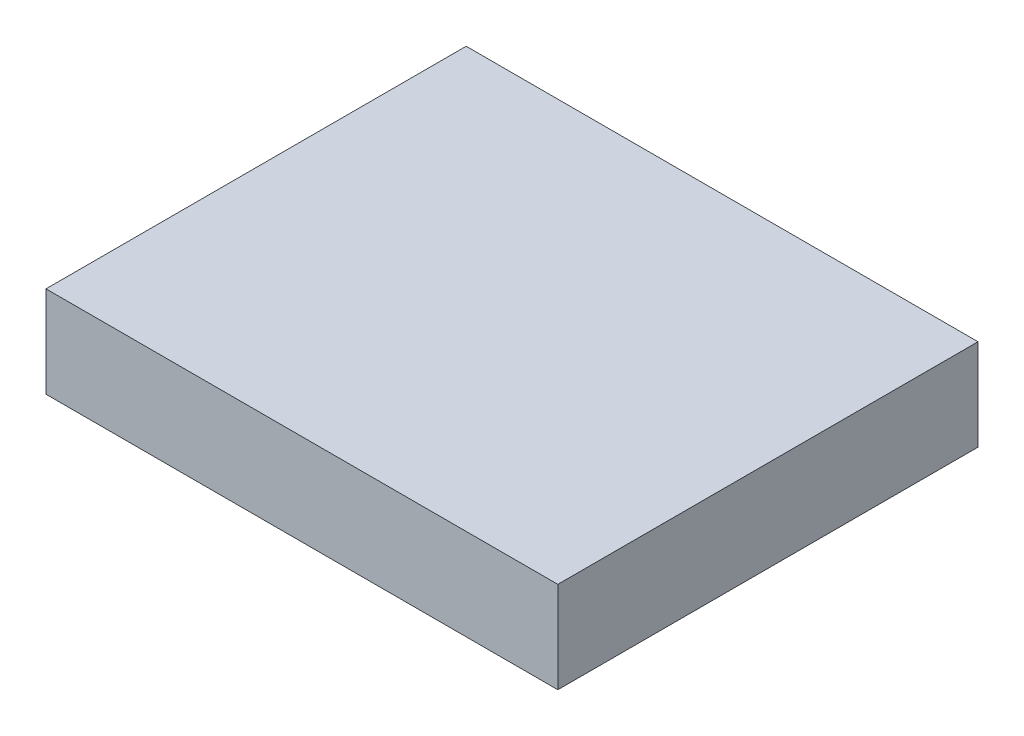
ISO-10303-21;
HEADER;
FILE_DESCRIPTION(('STEP AP214'),'2;1');
FILE_NAME('part.step','',(''),(''),'','','');
FILE_SCHEMA(('AUTOMOTIVE_DESIGN { 1 0 10303 214 1 1 1 1 }'));
ENDSEC;
DATA;
#1=APPLICATION_CONTEXT('core data for automotive mechanical design processes');
#2=APPLICATION_PROTOCOL_DEFINITION('international standard','automotive_design',2000,#1);
#3=PRODUCT_CONTEXT('',#1,'mechanical');
#4=PRODUCT('Part','Part','',(#3));
#5=PRODUCT_RELATED_PRODUCT_CATEGORY('part','',(#4));
#6=PRODUCT_DEFINITION_FORMATION('','',#4);
#7=PRODUCT_DEFINITION_CONTEXT('part definition',#1,'design');
#8=PRODUCT_DEFINITION('design','',#6,#7);
#9=PRODUCT_DEFINITION_SHAPE('','',#8);
#10=(LENGTH_UNIT() NAMED_UNIT(*) SI_UNIT(.MILLI.,.METRE.));
#11=(NAMED_UNIT(*) PLANE_ANGLE_UNIT() SI_UNIT($,.RADIAN.));
#12=(NAMED_UNIT(*) SI_UNIT($,.STERADIAN.) SOLID_ANGLE_UNIT());
#13=UNCERTAINTY_MEASURE_WITH_UNIT(LENGTH_MEASURE(1.E-05),#10,'distance_accuracy_value','');
#14=(GEOMETRIC_REPRESENTATION_CONTEXT(3) GLOBAL_UNCERTAINTY_ASSIGNED_CONTEXT((#13)) GLOBAL_UNIT_ASSIGNED_CONTEXT((#10,
#11,#12)) REPRESENTATION_CONTEXT('',''));
#15=CARTESIAN_POINT('',(0.,0.,0.));
#16=DIRECTION('',(0.,0.,1.));
#17=DIRECTION('',(1.,0.,0.));
#18=AXIS2_PLACEMENT_3D('',#15,#16,#17);
#19=CARTESIAN_POINT('',(-25.810949176075,5.900026226117,0.));
#20=DIRECTION('',(1.,0.,0.));
#21=DIRECTION('',(0.,1.,0.));
#22=AXIS2_PLACEMENT_3D('',#19,#20,#21);
#23=PLANE('',#22);
#24=DIRECTION('',(0.,-1.,0.));
#25=VECTOR('',#24,1.);
#26=CARTESIAN_POINT('',(-25.810949176075,5.921755362914,0.));
#27=LINE('',#26,#25);
#28=CARTESIAN_POINT('',(-25.810949176075,5.921755362914,0.));
#29=VERTEX_POINT('',#28);
#30=CARTESIAN_POINT('',(-25.810949176075,5.900026226117,0.));
#31=VERTEX_POINT('',#30);
#32=EDGE_CURVE('E11',#29,#31,#27,.T.);
#33=ORIENTED_EDGE('',*,*,#32,.F.);
#34=DIRECTION('',(0.,0.,1.));
#35=VECTOR('',#34,1.);
#36=CARTESIAN_POINT('',(-25.810949176075,5.921755362914,0.));
#37=LINE('',#36,#35);
#38=CARTESIAN_POINT('',(-25.810949176075,5.921755362914,0.1));
#39=VERTEX_POINT('',#38);
#40=EDGE_CURVE('E24',#29,#39,#37,.T.);
#41=ORIENTED_EDGE('',*,*,#40,.T.);
#42=DIRECTION('',(0.,1.,0.));
#43=VECTOR('',#42,1.);
#44=CARTESIAN_POINT('',(-25.810949176075,5.921755362914,0.1));
#45=LINE('',#44,#43);
#46=CARTESIAN_POINT('',(-25.810949176075,5.900026226117,0.1));
#47=VERTEX_POINT('',#46);
#48=EDGE_CURVE('E75',#47,#39,#45,.T.);
#49=ORIENTED_EDGE('',*,*,#48,.F.);
#50=DIRECTION('',(0.,0.,1.));
#51=VECTOR('',#50,1.);
#52=CARTESIAN_POINT('',(-25.810949176075,5.900026226117,0.));
#53=LINE('',#52,#51);
#54=EDGE_CURVE('E85',#31,#47,#53,.T.);
#55=ORIENTED_EDGE('',*,*,#54,.F.);
#56=EDGE_LOOP('',(#33,#41,#49,#55));
#57=FACE_BOUND('',#56,.T.);
#58=ADVANCED_FACE('F17',(#57),#23,.T.);
#59=CARTESIAN_POINT('',(-25.932755343422,5.900026226117,0.));
#60=DIRECTION('',(0.,-1.,0.));
#61=DIRECTION('',(1.,0.,0.));
#62=AXIS2_PLACEMENT_3D('',#59,#60,#61);
#63=PLANE('',#62);
#64=DIRECTION('',(-1.,0.,0.));
#65=VECTOR('',#64,1.);
#66=CARTESIAN_POINT('',(-25.810949176075,5.900026226117,0.));
#67=LINE('',#66,#65);
#68=CARTESIAN_POINT('',(-25.932755343422,5.900026226117,0.));
#69=VERTEX_POINT('',#68);
#70=EDGE_CURVE('E83',#31,#69,#67,.T.);
#71=ORIENTED_EDGE('',*,*,#70,.F.);
#72=ORIENTED_EDGE('',*,*,#54,.T.);
#73=DIRECTION('',(1.,0.,0.));
#74=VECTOR('',#73,1.);
#75=CARTESIAN_POINT('',(-25.810949176075,5.900026226117,0.1));
#76=LINE('',#75,#74);
#77=CARTESIAN_POINT('',(-25.932755343422,5.900026226117,0.1));
#78=VERTEX_POINT('',#77);
#79=EDGE_CURVE('E81',#78,#47,#76,.T.);
#80=ORIENTED_EDGE('',*,*,#79,.F.);
#81=DIRECTION('',(0.,0.,1.));
#82=VECTOR('',#81,1.);
#83=CARTESIAN_POINT('',(-25.932755343422,5.900026226117,0.));
#84=LINE('',#83,#82);
#85=EDGE_CURVE('E61',#69,#78,#84,.T.);
#86=ORIENTED_EDGE('',*,*,#85,.F.);
#87=EDGE_LOOP('',(#71,#72,#80,#86));
#88=FACE_BOUND('',#87,.T.);
#89=ADVANCED_FACE('F91',(#88),#63,.T.);
#90=CARTESIAN_POINT('',(-25.932755343422,5.921755362914,0.));
#91=DIRECTION('',(-1.,0.,0.));
#92=DIRECTION('',(0.,-1.,0.));
#93=AXIS2_PLACEMENT_3D('',#90,#91,#92);
#94=PLANE('',#93);
#95=DIRECTION('',(0.,1.,0.));
#96=VECTOR('',#95,1.);
#97=CARTESIAN_POINT('',(-25.932755343422,5.900026226117,0.));
#98=LINE('',#97,#96);
#99=CARTESIAN_POINT('',(-25.932755343422,5.921755362914,0.));
#100=VERTEX_POINT('',#99);
#101=EDGE_CURVE('E65',#69,#100,#98,.T.);
#102=ORIENTED_EDGE('',*,*,#101,.F.);
#103=ORIENTED_EDGE('',*,*,#85,.T.);
#104=DIRECTION('',(0.,-1.,0.));
#105=VECTOR('',#104,1.);
#106=CARTESIAN_POINT('',(-25.932755343422,5.900026226117,0.1));
#107=LINE('',#106,#105);
#108=CARTESIAN_POINT('',(-25.932755343422,5.921755362914,0.1));
#109=VERTEX_POINT('',#108);
#110=EDGE_CURVE('E54',#109,#78,#107,.T.);
#111=ORIENTED_EDGE('',*,*,#110,.F.);
#112=DIRECTION('',(0.,0.,1.));
#113=VECTOR('',#112,1.);
#114=CARTESIAN_POINT('',(-25.932755343422,5.921755362914,0.));
#115=LINE('',#114,#113);
#116=EDGE_CURVE('E58',#100,#109,#115,.T.);
#117=ORIENTED_EDGE('',*,*,#116,.F.);
#118=EDGE_LOOP('',(#102,#103,#111,#117));
#119=FACE_BOUND('',#118,.T.);
#120=ADVANCED_FACE('F57',(#119),#94,.T.);
#121=CARTESIAN_POINT('',(-25.810949176075,5.921755362914,0.));
#122=DIRECTION('',(0.,1.,0.));
#123=DIRECTION('',(-1.,0.,0.));
#124=AXIS2_PLACEMENT_3D('',#121,#122,#123);
#125=PLANE('',#124);
#126=DIRECTION('',(1.,0.,0.));
#127=VECTOR('',#126,1.);
#128=CARTESIAN_POINT('',(-25.932755343422,5.921755362914,0.));
#129=LINE('',#128,#127);
#130=EDGE_CURVE('E71',#100,#29,#129,.T.);
#131=ORIENTED_EDGE('',*,*,#130,.F.);
#132=ORIENTED_EDGE('',*,*,#116,.T.);
#133=DIRECTION('',(-1.,0.,0.));
#134=VECTOR('',#133,1.);
#135=CARTESIAN_POINT('',(-25.932755343422,5.921755362914,0.1));
#136=LINE('',#135,#134);
#137=EDGE_CURVE('E70',#39,#109,#136,.T.);
#138=ORIENTED_EDGE('',*,*,#137,.F.);
#139=ORIENTED_EDGE('',*,*,#40,.F.);
#140=EDGE_LOOP('',(#131,#132,#138,#139));
#141=FACE_BOUND('',#140,.T.);
#142=ADVANCED_FACE('F69',(#141),#125,.T.);
#143=CARTESIAN_POINT('',(-25.871852259748,5.910890794515,0.));
#144=DIRECTION('',(0.,0.,1.));
#145=DIRECTION('',(1.,0.,0.));
#146=AXIS2_PLACEMENT_3D('',#143,#144,#145);
#147=PLANE('',#146);
#148=ORIENTED_EDGE('',*,*,#130,.T.);
#149=ORIENTED_EDGE('',*,*,#32,.T.);
#150=ORIENTED_EDGE('',*,*,#70,.T.);
#151=ORIENTED_EDGE('',*,*,#101,.T.);
#152=EDGE_LOOP('',(#148,#149,#150,#151));
#153=FACE_BOUND('',#152,.T.);
#154=ADVANCED_FACE('F88',(#153),#147,.F.);
#155=CARTESIAN_POINT('',(-25.871852259748,5.910890794515,0.1));
#156=DIRECTION('',(0.,0.,1.));
#157=DIRECTION('',(1.,0.,0.));
#158=AXIS2_PLACEMENT_3D('',#155,#156,#157);
#159=PLANE('',#158);
#160=ORIENTED_EDGE('',*,*,#137,.T.);
#161=ORIENTED_EDGE('',*,*,#110,.T.);
#162=ORIENTED_EDGE('',*,*,#79,.T.);
#163=ORIENTED_EDGE('',*,*,#48,.T.);
#164=EDGE_LOOP('',(#160,#161,#162,#163));
#165=FACE_BOUND('',#164,.T.);
#166=ADVANCED_FACE('F74',(#165),#159,.T.);
#167=CLOSED_SHELL('',(#58,#89,#120,#142,#154,#166));
#168=MANIFOLD_SOLID_BREP('B1',#167);
#169=ADVANCED_BREP_SHAPE_REPRESENTATION('',(#18,#168),#14);
#170=SHAPE_DEFINITION_REPRESENTATION(#9,#169);
ENDSEC;
END-ISO-10303-21;
